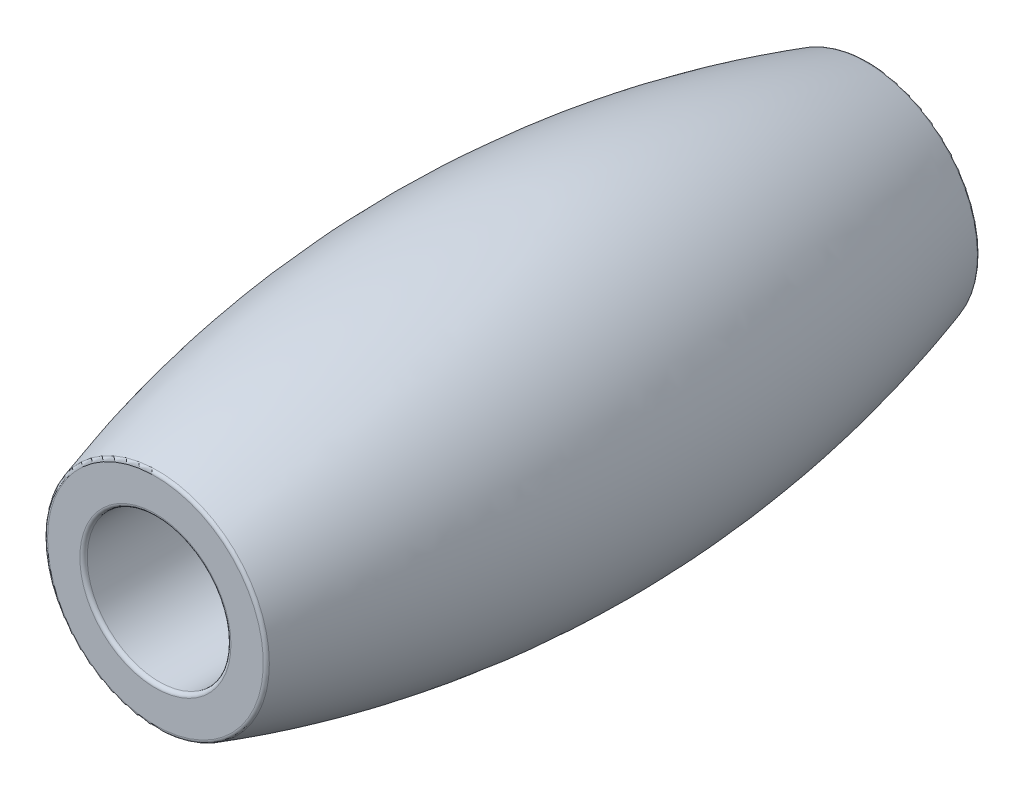
ISO-10303-21;
HEADER;
FILE_DESCRIPTION(('STEP AP214'),'2;1');
FILE_NAME('part.step','',(''),(''),'','','');
FILE_SCHEMA(('AUTOMOTIVE_DESIGN { 1 0 10303 214 1 1 1 1 }'));
ENDSEC;
DATA;
#1=APPLICATION_CONTEXT('core data for automotive mechanical design processes');
#2=APPLICATION_PROTOCOL_DEFINITION('international standard','automotive_design',2000,#1);
#3=PRODUCT_CONTEXT('',#1,'mechanical');
#4=PRODUCT('Part','Part','',(#3));
#5=PRODUCT_RELATED_PRODUCT_CATEGORY('part','',(#4));
#6=PRODUCT_DEFINITION_FORMATION('','',#4);
#7=PRODUCT_DEFINITION_CONTEXT('part definition',#1,'design');
#8=PRODUCT_DEFINITION('design','',#6,#7);
#9=PRODUCT_DEFINITION_SHAPE('','',#8);
#10=(LENGTH_UNIT() NAMED_UNIT(*) SI_UNIT(.MILLI.,.METRE.));
#11=(NAMED_UNIT(*) PLANE_ANGLE_UNIT() SI_UNIT($,.RADIAN.));
#12=(NAMED_UNIT(*) SI_UNIT($,.STERADIAN.) SOLID_ANGLE_UNIT());
#13=UNCERTAINTY_MEASURE_WITH_UNIT(LENGTH_MEASURE(1.E-05),#10,'distance_accuracy_value','');
#14=(GEOMETRIC_REPRESENTATION_CONTEXT(3) GLOBAL_UNCERTAINTY_ASSIGNED_CONTEXT((#13)) GLOBAL_UNIT_ASSIGNED_CONTEXT((#10,
#11,#12)) REPRESENTATION_CONTEXT('',''));
#15=CARTESIAN_POINT('',(0.,0.,0.));
#16=DIRECTION('',(0.,0.,1.));
#17=DIRECTION('',(1.,0.,0.));
#18=AXIS2_PLACEMENT_3D('',#15,#16,#17);
#19=CARTESIAN_POINT('',(0.,0.,9.575));
#20=DIRECTION('',(0.,0.,-1.));
#21=DIRECTION('',(-1.,0.,0.));
#22=AXIS2_PLACEMENT_3D('',#19,#20,#21);
#23=TOROIDAL_SURFACE('',#22,2.05,0.1);
#24=CARTESIAN_POINT('',(0.,0.,9.675));
#25=DIRECTION('',(0.,0.,1.));
#26=DIRECTION('',(-1.,0.,0.));
#27=AXIS2_PLACEMENT_3D('',#24,#25,#26);
#28=CIRCLE('',#27,2.05);
#29=CARTESIAN_POINT('',(2.05,0.,9.675));
#30=VERTEX_POINT('',#29);
#31=EDGE_CURVE('E20',#30,#30,#28,.T.);
#32=ORIENTED_EDGE('',*,*,#31,.T.);
#33=CARTESIAN_POINT('',(2.05,0.,9.575));
#34=DIRECTION('',(0.,-1.,0.));
#35=DIRECTION('',(1.,0.,0.));
#36=AXIS2_PLACEMENT_3D('',#33,#34,#35);
#37=CIRCLE('',#36,0.1);
#38=CARTESIAN_POINT('',(1.95,0.,9.575));
#39=VERTEX_POINT('',#38);
#40=EDGE_CURVE('E11',#30,#39,#37,.T.);
#41=ORIENTED_EDGE('',*,*,#40,.T.);
#42=CARTESIAN_POINT('',(0.,0.,9.575));
#43=DIRECTION('',(0.,0.,-1.));
#44=DIRECTION('',(-1.,0.,0.));
#45=AXIS2_PLACEMENT_3D('',#42,#43,#44);
#46=CIRCLE('',#45,1.95);
#47=EDGE_CURVE('E97',#39,#39,#46,.T.);
#48=ORIENTED_EDGE('',*,*,#47,.T.);
#49=ORIENTED_EDGE('',*,*,#40,.F.);
#50=EDGE_LOOP('',(#32,#41,#48,#49));
#51=FACE_BOUND('',#50,.T.);
#52=ADVANCED_FACE('F17',(#51),#23,.T.);
#53=CARTESIAN_POINT('',(0.,0.,9.675));
#54=DIRECTION('',(0.,0.,1.));
#55=DIRECTION('',(1.,0.,0.));
#56=AXIS2_PLACEMENT_3D('',#53,#54,#55);
#57=PLANE('',#56);
#58=ORIENTED_EDGE('',*,*,#31,.F.);
#59=EDGE_LOOP('',(#58));
#60=FACE_BOUND('',#59,.T.);
#61=CARTESIAN_POINT('',(0.,0.,9.675));
#62=DIRECTION('',(0.,0.,-1.));
#63=DIRECTION('',(0.,-1.,0.));
#64=AXIS2_PLACEMENT_3D('',#61,#62,#63);
#65=CIRCLE('',#64,2.9267575567104);
#66=CARTESIAN_POINT('',(-2.9267575567104,0.,9.675));
#67=VERTEX_POINT('',#66);
#68=EDGE_CURVE('E117',#67,#67,#65,.T.);
#69=ORIENTED_EDGE('',*,*,#68,.F.);
#70=EDGE_LOOP('',(#69));
#71=FACE_BOUND('',#70,.T.);
#72=ADVANCED_FACE('F138',(#60,#71),#57,.T.);
#73=CARTESIAN_POINT('',(0.,0.,9.575));
#74=DIRECTION('',(0.,0.,1.));
#75=DIRECTION('',(1.,0.,0.));
#76=AXIS2_PLACEMENT_3D('',#73,#74,#75);
#77=TOROIDAL_SURFACE('',#76,2.9267575567104,0.1);
#78=ORIENTED_EDGE('',*,*,#68,.T.);
#79=CARTESIAN_POINT('',(-2.9267575567104,0.,9.575));
#80=DIRECTION('',(0.,-1.,0.));
#81=DIRECTION('',(-1.,0.,0.));
#82=AXIS2_PLACEMENT_3D('',#79,#80,#81);
#83=CIRCLE('',#82,0.1);
#84=CARTESIAN_POINT('',(-3.02213226402892,0.,9.60506102466495));
#85=VERTEX_POINT('',#84);
#86=EDGE_CURVE('E114',#67,#85,#83,.T.);
#87=ORIENTED_EDGE('',*,*,#86,.T.);
#88=CARTESIAN_POINT('',(0.,0.,9.60506102466495));
#89=DIRECTION('',(0.,0.,1.));
#90=DIRECTION('',(0.,-1.,0.));
#91=AXIS2_PLACEMENT_3D('',#88,#89,#90);
#92=CIRCLE('',#91,3.02213226402892);
#93=CARTESIAN_POINT('',(3.02213226402892,0.,9.60506102466495));
#94=VERTEX_POINT('',#93);
#95=EDGE_CURVE('E105',#85,#94,#92,.T.);
#96=ORIENTED_EDGE('',*,*,#95,.T.);
#97=CARTESIAN_POINT('',(0.,0.,9.60506102466495));
#98=DIRECTION('',(0.,0.,1.));
#99=DIRECTION('',(0.,-1.,0.));
#100=AXIS2_PLACEMENT_3D('',#97,#98,#99);
#101=CIRCLE('',#100,3.02213226402892);
#102=EDGE_CURVE('E120',#94,#85,#101,.T.);
#103=ORIENTED_EDGE('',*,*,#102,.T.);
#104=ORIENTED_EDGE('',*,*,#86,.F.);
#105=EDGE_LOOP('',(#78,#87,#96,#103,#104));
#106=FACE_BOUND('',#105,.T.);
#107=ADVANCED_FACE('F134',(#106),#77,.T.);
#108=CARTESIAN_POINT('',(0.,0.,0.));
#109=DIRECTION('',(0.,0.,1.));
#110=DIRECTION('',(-1.,0.,0.));
#111=AXIS2_PLACEMENT_3D('',#108,#109,#110);
#112=CYLINDRICAL_SURFACE('',#111,1.95);
#113=ORIENTED_EDGE('',*,*,#47,.F.);
#114=DIRECTION('',(0.,0.,-1.));
#115=VECTOR('',#114,1.);
#116=CARTESIAN_POINT('',(1.95,0.,0.));
#117=LINE('',#116,#115);
#118=CARTESIAN_POINT('',(1.95,0.,-9.575));
#119=VERTEX_POINT('',#118);
#120=EDGE_CURVE('E84',#39,#119,#117,.T.);
#121=ORIENTED_EDGE('',*,*,#120,.T.);
#122=CARTESIAN_POINT('',(0.,0.,-9.575));
#123=DIRECTION('',(0.,0.,1.));
#124=DIRECTION('',(-1.,0.,0.));
#125=AXIS2_PLACEMENT_3D('',#122,#123,#124);
#126=CIRCLE('',#125,1.95);
#127=CARTESIAN_POINT('',(-1.95,0.,-9.575));
#128=VERTEX_POINT('',#127);
#129=EDGE_CURVE('E95',#128,#119,#126,.T.);
#130=ORIENTED_EDGE('',*,*,#129,.F.);
#131=CARTESIAN_POINT('',(0.,0.,-9.575));
#132=DIRECTION('',(0.,0.,1.));
#133=DIRECTION('',(-1.,0.,0.));
#134=AXIS2_PLACEMENT_3D('',#131,#132,#133);
#135=CIRCLE('',#134,1.95);
#136=EDGE_CURVE('E90',#119,#128,#135,.T.);
#137=ORIENTED_EDGE('',*,*,#136,.F.);
#138=ORIENTED_EDGE('',*,*,#120,.F.);
#139=EDGE_LOOP('',(#113,#121,#130,#137,#138));
#140=FACE_BOUND('',#139,.T.);
#141=ADVANCED_FACE('F99',(#140),#112,.F.);
#142=CARTESIAN_POINT('',(0.,0.,-9.575));
#143=DIRECTION('',(0.,0.,1.));
#144=DIRECTION('',(1.,0.,0.));
#145=AXIS2_PLACEMENT_3D('',#142,#143,#144);
#146=TOROIDAL_SURFACE('',#145,2.05,0.1);
#147=CARTESIAN_POINT('',(0.,0.,-9.675));
#148=DIRECTION('',(0.,0.,-1.));
#149=DIRECTION('',(-1.,0.,0.));
#150=AXIS2_PLACEMENT_3D('',#147,#148,#149);
#151=CIRCLE('',#150,2.05);
#152=CARTESIAN_POINT('',(-2.05,0.,-9.675));
#153=VERTEX_POINT('',#152);
#154=EDGE_CURVE('E103',#153,#153,#151,.T.);
#155=ORIENTED_EDGE('',*,*,#154,.T.);
#156=CARTESIAN_POINT('',(-2.05,0.,-9.575));
#157=DIRECTION('',(0.,-1.,0.));
#158=DIRECTION('',(-1.,0.,0.));
#159=AXIS2_PLACEMENT_3D('',#156,#157,#158);
#160=CIRCLE('',#159,0.1);
#161=EDGE_CURVE('E94',#153,#128,#160,.T.);
#162=ORIENTED_EDGE('',*,*,#161,.T.);
#163=ORIENTED_EDGE('',*,*,#129,.T.);
#164=ORIENTED_EDGE('',*,*,#136,.T.);
#165=ORIENTED_EDGE('',*,*,#161,.F.);
#166=EDGE_LOOP('',(#155,#162,#163,#164,#165));
#167=FACE_BOUND('',#166,.T.);
#168=ADVANCED_FACE('F92',(#167),#146,.T.);
#169=CARTESIAN_POINT('',(3.02213226402892,0.,9.60506102466495));
#170=CARTESIAN_POINT('',(3.02213226402892,-3.02213226402892,9.60506102466495));
#171=CARTESIAN_POINT('',(0.,-3.02213226402892,9.60506102466495));
#172=CARTESIAN_POINT('',(-3.02213226402892,-3.02213226402892,9.60506102466495));
#173=CARTESIAN_POINT('',(-3.02213226402892,0.,9.60506102466495));
#174=CARTESIAN_POINT('',(-3.02213226402892,3.02213226402892,9.60506102466495));
#175=CARTESIAN_POINT('',(0.,3.02213226402892,9.60506102466495));
#176=CARTESIAN_POINT('',(3.02213226402892,3.02213226402892,9.60506102466495));
#177=CARTESIAN_POINT('',(3.02213226402892,0.,9.60506102466495));
#178=CARTESIAN_POINT('',(6.04953842325883,0.,0.));
#179=CARTESIAN_POINT('',(6.04953842325881,-6.04953842325881,0.));
#180=CARTESIAN_POINT('',(0.,-6.04953842325883,0.));
#181=CARTESIAN_POINT('',(-6.04953842325881,-6.04953842325881,0.));
#182=CARTESIAN_POINT('',(-6.04953842325883,0.,0.));
#183=CARTESIAN_POINT('',(-6.04953842325881,6.04953842325881,0.));
#184=CARTESIAN_POINT('',(0.,6.04953842325883,0.));
#185=CARTESIAN_POINT('',(6.04953842325881,6.04953842325881,0.));
#186=CARTESIAN_POINT('',(6.04953842325883,0.,0.));
#187=CARTESIAN_POINT('',(3.02213226402892,0.,-9.60506102466495));
#188=CARTESIAN_POINT('',(3.02213226402892,-3.02213226402892,-9.60506102466495));
#189=CARTESIAN_POINT('',(0.,-3.02213226402892,-9.60506102466495));
#190=CARTESIAN_POINT('',(-3.02213226402892,-3.02213226402892,-9.60506102466495));
#191=CARTESIAN_POINT('',(-3.02213226402892,0.,-9.60506102466495));
#192=CARTESIAN_POINT('',(-3.02213226402892,3.02213226402892,-9.60506102466495));
#193=CARTESIAN_POINT('',(0.,3.02213226402892,-9.60506102466495));
#194=CARTESIAN_POINT('',(3.02213226402892,3.02213226402892,-9.60506102466495));
#195=CARTESIAN_POINT('',(3.02213226402892,0.,-9.60506102466495));
#196=(BOUNDED_SURFACE() B_SPLINE_SURFACE(2,2,((#169,#170,#171,#172,#173,#174,#175,#176,#177),
(#178,#179,#180,#181,#182,#183,#184,#185,#186),(#187,#188,#189,#190,#191,#192,#193,#194,#195)),
.UNSPECIFIED.,.F.,.T.,.F.) B_SPLINE_SURFACE_WITH_KNOTS((3,3),(3,2,2,2,3),(-0.30533243073009,
0.30533243073009),(-3.14159265358979,-1.5707963267949,0.,1.5707963267949,3.14159265358979),
.UNSPECIFIED.) GEOMETRIC_REPRESENTATION_ITEM() RATIONAL_B_SPLINE_SURFACE(((1.,0.707106781186548,
1.,0.707106781186548,1.,0.707106781186548,1.,0.707106781186548,1.),(0.953747073185186,
0.674401022986067,0.953747073185186,0.674401022986067,0.953747073185186,0.674401022986067,
0.953747073185186,0.674401022986067,0.953747073185186),(1.,0.707106781186548,1.,
0.707106781186548,1.,0.707106781186548,1.,0.707106781186548,1.))) REPRESENTATION_ITEM('') SURFACE());
#197=CARTESIAN_POINT('',(-27.451875,0.,0.));
#198=DIRECTION('',(0.,1.,0.));
#199=DIRECTION('',(1.,0.,0.));
#200=AXIS2_PLACEMENT_3D('',#197,#198,#199);
#201=CIRCLE('',#200,31.951875);
#202=CARTESIAN_POINT('',(3.02213226402892,0.,-9.60506102466495));
#203=VERTEX_POINT('',#202);
#204=EDGE_CURVE('E53',#94,#203,#201,.T.);
#205=CARTESIAN_POINT('',(0.,0.,-9.60506102466495));
#206=DIRECTION('',(0.,0.,-1.));
#207=DIRECTION('',(0.,-1.,0.));
#208=AXIS2_PLACEMENT_3D('',#205,#206,#207);
#209=CIRCLE('',#208,3.02213226402892);
#210=EDGE_CURVE('E121',#203,#203,#209,.T.);
#211=ORIENTED_EDGE('',*,*,#102,.F.);
#212=ORIENTED_EDGE('',*,*,#204,.T.);
#213=ORIENTED_EDGE('',*,*,#210,.F.);
#214=ORIENTED_EDGE('',*,*,#204,.F.);
#215=ORIENTED_EDGE('',*,*,#95,.F.);
#216=EDGE_LOOP('',(#211,#212,#213,#214,#215));
#217=FACE_BOUND('',#216,.T.);
#218=ADVANCED_FACE('F156',(#217),#196,.F.);
#219=CARTESIAN_POINT('',(0.,0.,-9.675));
#220=DIRECTION('',(0.,0.,1.));
#221=DIRECTION('',(1.,0.,0.));
#222=AXIS2_PLACEMENT_3D('',#219,#220,#221);
#223=PLANE('',#222);
#224=ORIENTED_EDGE('',*,*,#154,.F.);
#225=EDGE_LOOP('',(#224));
#226=FACE_BOUND('',#225,.T.);
#227=CARTESIAN_POINT('',(0.,0.,-9.675));
#228=DIRECTION('',(0.,0.,1.));
#229=DIRECTION('',(0.,-1.,0.));
#230=AXIS2_PLACEMENT_3D('',#227,#228,#229);
#231=CIRCLE('',#230,2.9267575567104);
#232=CARTESIAN_POINT('',(2.9267575567104,0.,-9.675));
#233=VERTEX_POINT('',#232);
#234=EDGE_CURVE('E175',#233,#233,#231,.T.);
#235=ORIENTED_EDGE('',*,*,#234,.F.);
#236=EDGE_LOOP('',(#235));
#237=FACE_BOUND('',#236,.T.);
#238=ADVANCED_FACE('F153',(#226,#237),#223,.F.);
#239=CARTESIAN_POINT('',(0.,0.,-9.575));
#240=DIRECTION('',(0.,0.,-1.));
#241=DIRECTION('',(-1.,0.,0.));
#242=AXIS2_PLACEMENT_3D('',#239,#240,#241);
#243=TOROIDAL_SURFACE('',#242,2.9267575567104,0.1);
#244=ORIENTED_EDGE('',*,*,#234,.T.);
#245=CARTESIAN_POINT('',(2.9267575567104,0.,-9.575));
#246=DIRECTION('',(0.,-1.,0.));
#247=DIRECTION('',(1.,0.,0.));
#248=AXIS2_PLACEMENT_3D('',#245,#246,#247);
#249=CIRCLE('',#248,0.1);
#250=EDGE_CURVE('E67',#233,#203,#249,.T.);
#251=ORIENTED_EDGE('',*,*,#250,.T.);
#252=ORIENTED_EDGE('',*,*,#210,.T.);
#253=ORIENTED_EDGE('',*,*,#250,.F.);
#254=EDGE_LOOP('',(#244,#251,#252,#253));
#255=FACE_BOUND('',#254,.T.);
#256=ADVANCED_FACE('F150',(#255),#243,.T.);
#257=CLOSED_SHELL('',(#52,#72,#107,#141,#168,#218,#238,#256));
#258=MANIFOLD_SOLID_BREP('B1',#257);
#259=ADVANCED_BREP_SHAPE_REPRESENTATION('',(#18,#258),#14);
#260=SHAPE_DEFINITION_REPRESENTATION(#9,#259);
ENDSEC;
END-ISO-10303-21;
